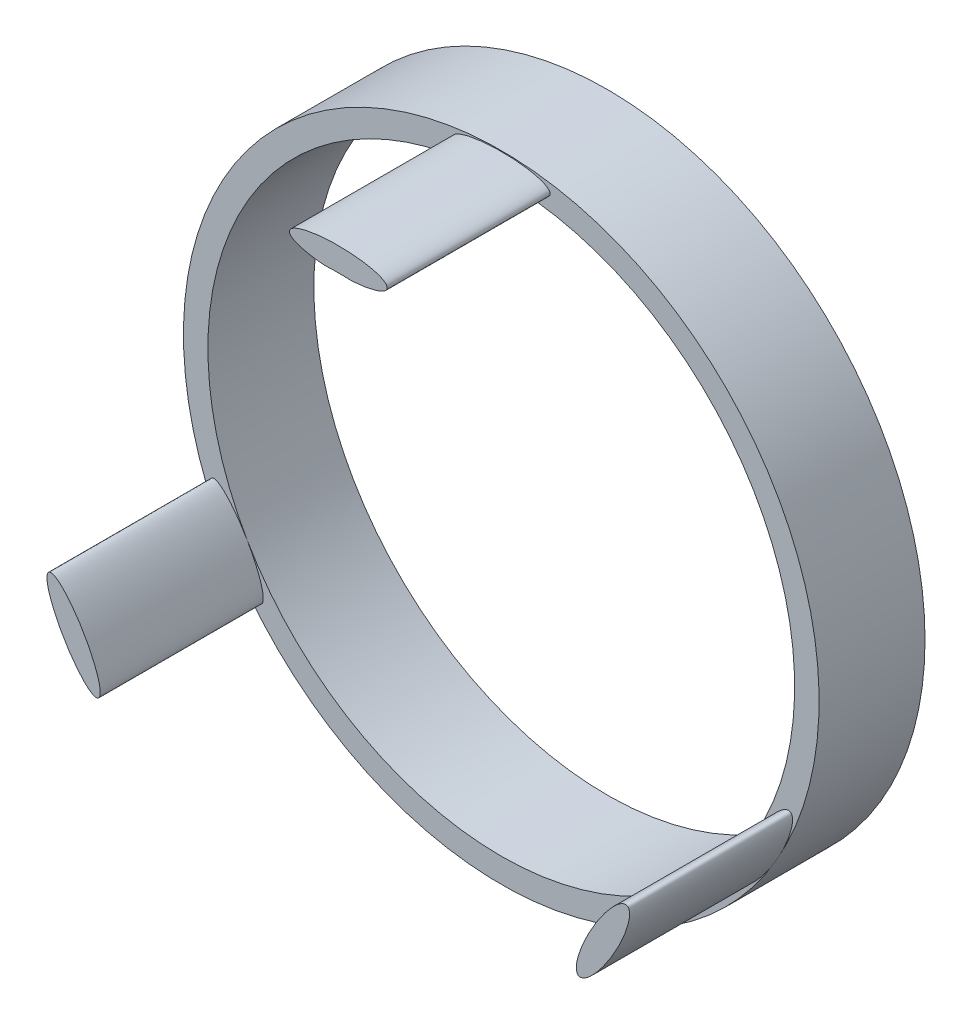
ISO-10303-21;
HEADER;
FILE_DESCRIPTION(('STEP AP214'),'2;1');
FILE_NAME('part.step','',(''),(''),'','','');
FILE_SCHEMA(('AUTOMOTIVE_DESIGN { 1 0 10303 214 1 1 1 1 }'));
ENDSEC;
DATA;
#1=APPLICATION_CONTEXT('core data for automotive mechanical design processes');
#2=APPLICATION_PROTOCOL_DEFINITION('international standard','automotive_design',2000,#1);
#3=PRODUCT_CONTEXT('',#1,'mechanical');
#4=PRODUCT('Part','Part','',(#3));
#5=PRODUCT_RELATED_PRODUCT_CATEGORY('part','',(#4));
#6=PRODUCT_DEFINITION_FORMATION('','',#4);
#7=PRODUCT_DEFINITION_CONTEXT('part definition',#1,'design');
#8=PRODUCT_DEFINITION('design','',#6,#7);
#9=PRODUCT_DEFINITION_SHAPE('','',#8);
#10=(LENGTH_UNIT() NAMED_UNIT(*) SI_UNIT(.MILLI.,.METRE.));
#11=(NAMED_UNIT(*) PLANE_ANGLE_UNIT() SI_UNIT($,.RADIAN.));
#12=(NAMED_UNIT(*) SI_UNIT($,.STERADIAN.) SOLID_ANGLE_UNIT());
#13=UNCERTAINTY_MEASURE_WITH_UNIT(LENGTH_MEASURE(1.E-05),#10,'distance_accuracy_value','');
#14=(GEOMETRIC_REPRESENTATION_CONTEXT(3) GLOBAL_UNCERTAINTY_ASSIGNED_CONTEXT((#13)) GLOBAL_UNIT_ASSIGNED_CONTEXT((#10,
#11,#12)) REPRESENTATION_CONTEXT('',''));
#15=CARTESIAN_POINT('',(0.,0.,0.));
#16=DIRECTION('',(0.,0.,1.));
#17=DIRECTION('',(1.,0.,0.));
#18=AXIS2_PLACEMENT_3D('',#15,#16,#17);
#19=CARTESIAN_POINT('',(0.,0.,6.5));
#20=DIRECTION('',(0.,0.,1.));
#21=DIRECTION('',(1.,0.,0.));
#22=AXIS2_PLACEMENT_3D('',#19,#20,#21);
#23=PLANE('',#22);
#24=CARTESIAN_POINT('',(0.,0.,6.5));
#25=DIRECTION('',(0.,0.,1.));
#26=DIRECTION('',(1.,0.,0.));
#27=AXIS2_PLACEMENT_3D('',#24,#25,#26);
#28=CIRCLE('',#27,18.);
#29=CARTESIAN_POINT('',(15.5884572681198,-9.00000000000011,6.5));
#30=VERTEX_POINT('',#29);
#31=CARTESIAN_POINT('',(0.852605665125994,17.9797959827078,6.5));
#32=VERTEX_POINT('',#31);
#33=EDGE_CURVE('E89',#30,#32,#28,.T.);
#34=ORIENTED_EDGE('',*,*,#33,.F.);
#35=CARTESIAN_POINT('',(16.2379763209581,-9.37500000000014,6.5));
#36=DIRECTION('',(0.,0.,1.));
#37=DIRECTION('',(-0.500000000000008,-0.866025403784434,0.));
#38=AXIS2_PLACEMENT_3D('',#35,#36,#37);
#39=ELLIPSE('',#38,3.,0.750000000000003);
#40=CARTESIAN_POINT('',(16.8874953737942,-9.75000000000397,6.5));
#41=VERTEX_POINT('',#40);
#42=EDGE_CURVE('E55',#41,#30,#39,.T.);
#43=ORIENTED_EDGE('',*,*,#42,.F.);
#44=CARTESIAN_POINT('',(0.,0.,6.5));
#45=DIRECTION('',(0.,0.,1.));
#46=DIRECTION('',(1.,0.,0.));
#47=AXIS2_PLACEMENT_3D('',#44,#45,#46);
#48=CIRCLE('',#47,19.5);
#49=CARTESIAN_POINT('',(-16.8936536457525,-9.73932727123875,6.5));
#50=VERTEX_POINT('',#49);
#51=EDGE_CURVE('E49',#41,#50,#48,.T.);
#52=ORIENTED_EDGE('',*,*,#51,.T.);
#53=CARTESIAN_POINT('',(-16.2403459612265,-9.37089566265974,6.5));
#54=DIRECTION('',(0.,0.,1.));
#55=DIRECTION('',(-0.50000000000001,0.866025403784433,0.));
#56=AXIS2_PLACEMENT_3D('',#53,#54,#55);
#57=ELLIPSE('',#56,3.,0.75);
#58=CARTESIAN_POINT('',(-15.5898788578268,-8.99753728518448,6.5));
#59=VERTEX_POINT('',#58);
#60=EDGE_CURVE('E99',#59,#50,#57,.T.);
#61=ORIENTED_EDGE('',*,*,#60,.F.);
#62=CARTESIAN_POINT('',(-0.852605665125994,17.9797959827078,6.5));
#63=VERTEX_POINT('',#62);
#64=EDGE_CURVE('E237',#63,#59,#28,.T.);
#65=ORIENTED_EDGE('',*,*,#64,.F.);
#66=CARTESIAN_POINT('',(0.,18.6988693264893,6.5));
#67=DIRECTION('',(0.,0.,1.));
#68=DIRECTION('',(1.,0.,0.));
#69=AXIS2_PLACEMENT_3D('',#66,#67,#68);
#70=ELLIPSE('',#69,3.,0.750000000000001);
#71=EDGE_CURVE('E102',#32,#63,#70,.T.);
#72=ORIENTED_EDGE('',*,*,#71,.F.);
#73=EDGE_LOOP('',(#34,#43,#52,#61,#65,#72));
#74=FACE_BOUND('',#73,.T.);
#75=ADVANCED_FACE('F40',(#74),#23,.T.);
#76=EDGE_CURVE('E11',#50,#41,#48,.T.);
#77=ORIENTED_EDGE('',*,*,#76,.T.);
#78=EDGE_CURVE('E80',#30,#41,#39,.T.);
#79=ORIENTED_EDGE('',*,*,#78,.F.);
#80=EDGE_CURVE('E96',#59,#30,#28,.T.);
#81=ORIENTED_EDGE('',*,*,#80,.F.);
#82=EDGE_CURVE('E62',#50,#59,#57,.T.);
#83=ORIENTED_EDGE('',*,*,#82,.F.);
#84=EDGE_LOOP('',(#77,#79,#81,#83));
#85=FACE_BOUND('',#84,.T.);
#86=ADVANCED_FACE('F95',(#85),#23,.T.);
#87=CARTESIAN_POINT('',(0.,0.,0.));
#88=DIRECTION('',(0.,0.,1.));
#89=DIRECTION('',(1.,0.,0.));
#90=AXIS2_PLACEMENT_3D('',#87,#88,#89);
#91=PLANE('',#90);
#92=CARTESIAN_POINT('',(0.,0.,0.));
#93=DIRECTION('',(0.,0.,1.));
#94=DIRECTION('',(1.,0.,0.));
#95=AXIS2_PLACEMENT_3D('',#92,#93,#94);
#96=CIRCLE('',#95,19.5);
#97=CARTESIAN_POINT('',(19.5,0.,0.));
#98=VERTEX_POINT('',#97);
#99=EDGE_CURVE('E44',#98,#98,#96,.T.);
#100=ORIENTED_EDGE('',*,*,#99,.F.);
#101=EDGE_LOOP('',(#100));
#102=FACE_BOUND('',#101,.T.);
#103=CARTESIAN_POINT('',(0.,0.,0.));
#104=DIRECTION('',(0.,0.,1.));
#105=DIRECTION('',(1.,0.,0.));
#106=AXIS2_PLACEMENT_3D('',#103,#104,#105);
#107=CIRCLE('',#106,18.);
#108=CARTESIAN_POINT('',(18.,0.,0.));
#109=VERTEX_POINT('',#108);
#110=EDGE_CURVE('E232',#109,#109,#107,.T.);
#111=ORIENTED_EDGE('',*,*,#110,.T.);
#112=EDGE_LOOP('',(#111));
#113=FACE_BOUND('',#112,.T.);
#114=ADVANCED_FACE('F127',(#102,#113),#91,.F.);
#115=CARTESIAN_POINT('',(0.,0.,6.5));
#116=DIRECTION('',(0.,0.,-1.));
#117=DIRECTION('',(-1.,0.,0.));
#118=AXIS2_PLACEMENT_3D('',#115,#116,#117);
#119=CYLINDRICAL_SURFACE('',#118,19.5);
#120=ORIENTED_EDGE('',*,*,#76,.F.);
#121=ORIENTED_EDGE('',*,*,#51,.F.);
#122=EDGE_LOOP('',(#120,#121));
#123=FACE_BOUND('',#122,.T.);
#124=ORIENTED_EDGE('',*,*,#99,.T.);
#125=EDGE_LOOP('',(#124));
#126=FACE_BOUND('',#125,.T.);
#127=ADVANCED_FACE('F42',(#123,#126),#119,.T.);
#128=CARTESIAN_POINT('',(0.,0.,6.5));
#129=DIRECTION('',(0.,0.,-1.));
#130=DIRECTION('',(-1.,0.,0.));
#131=AXIS2_PLACEMENT_3D('',#128,#129,#130);
#132=CYLINDRICAL_SURFACE('',#131,18.);
#133=ORIENTED_EDGE('',*,*,#64,.T.);
#134=ORIENTED_EDGE('',*,*,#80,.T.);
#135=ORIENTED_EDGE('',*,*,#33,.T.);
#136=DIRECTION('',(0.,0.,-1.));
#137=VECTOR('',#136,1.);
#138=CARTESIAN_POINT('',(0.852605665125994,17.9797959827078,16.5));
#139=LINE('',#138,#137);
#140=CARTESIAN_POINT('',(0.852605665125994,17.9797959827078,16.5));
#141=VERTEX_POINT('',#140);
#142=EDGE_CURVE('E229',#141,#32,#139,.T.);
#143=ORIENTED_EDGE('',*,*,#142,.F.);
#144=CARTESIAN_POINT('',(0.,0.,16.5));
#145=DIRECTION('',(0.,0.,1.));
#146=DIRECTION('',(1.,0.,0.));
#147=AXIS2_PLACEMENT_3D('',#144,#145,#146);
#148=CIRCLE('',#147,18.);
#149=CARTESIAN_POINT('',(-0.852605665125994,17.9797959827078,16.5));
#150=VERTEX_POINT('',#149);
#151=EDGE_CURVE('E106',#150,#141,#148,.F.);
#152=ORIENTED_EDGE('',*,*,#151,.F.);
#153=DIRECTION('',(0.,0.,-1.));
#154=VECTOR('',#153,1.);
#155=CARTESIAN_POINT('',(-0.852605665125994,17.9797959827078,16.5));
#156=LINE('',#155,#154);
#157=EDGE_CURVE('E112',#150,#63,#156,.T.);
#158=ORIENTED_EDGE('',*,*,#157,.T.);
#159=EDGE_LOOP('',(#133,#134,#135,#143,#152,#158));
#160=FACE_BOUND('',#159,.T.);
#161=ORIENTED_EDGE('',*,*,#110,.F.);
#162=EDGE_LOOP('',(#161));
#163=FACE_BOUND('',#162,.T.);
#164=ADVANCED_FACE('F120',(#160,#163),#132,.F.);
#165=CARTESIAN_POINT('',(0.,18.6988693264893,16.5));
#166=DIRECTION('',(0.,0.,1.));
#167=DIRECTION('',(1.,0.,0.));
#168=AXIS2_PLACEMENT_3D('',#165,#166,#167);
#169=ELLIPSE('',#168,3.,0.750000000000001);
#170=DIRECTION('',(0.,0.,-1.));
#171=VECTOR('',#170,1.);
#172=SURFACE_OF_LINEAR_EXTRUSION('',#169,#171);
#173=ORIENTED_EDGE('',*,*,#71,.T.);
#174=ORIENTED_EDGE('',*,*,#157,.F.);
#175=EDGE_CURVE('E109',#141,#150,#169,.T.);
#176=ORIENTED_EDGE('',*,*,#175,.F.);
#177=ORIENTED_EDGE('',*,*,#142,.T.);
#178=EDGE_LOOP('',(#173,#174,#176,#177));
#179=FACE_BOUND('',#178,.T.);
#180=ADVANCED_FACE('F115',(#179),#172,.F.);
#181=CARTESIAN_POINT('',(0.,0.,16.5));
#182=DIRECTION('',(0.,0.,1.));
#183=DIRECTION('',(1.,0.,0.));
#184=AXIS2_PLACEMENT_3D('',#181,#182,#183);
#185=PLANE('',#184);
#186=ORIENTED_EDGE('',*,*,#151,.T.);
#187=ORIENTED_EDGE('',*,*,#175,.T.);
#188=EDGE_LOOP('',(#186,#187));
#189=FACE_BOUND('',#188,.T.);
#190=ADVANCED_FACE('F119',(#189),#185,.T.);
#191=CARTESIAN_POINT('',(-16.2403459612265,-9.37089566265974,16.5));
#192=DIRECTION('',(0.,0.,1.));
#193=DIRECTION('',(-0.50000000000001,0.866025403784433,0.));
#194=AXIS2_PLACEMENT_3D('',#191,#192,#193);
#195=ELLIPSE('',#194,3.,0.75);
#196=DIRECTION('',(0.,0.,-1.));
#197=VECTOR('',#196,1.);
#198=SURFACE_OF_LINEAR_EXTRUSION('',#195,#197);
#199=CARTESIAN_POINT('',(-17.7403459612265,-6.77281945130644,16.5));
#200=VERTEX_POINT('',#199);
#201=EDGE_CURVE('E98',#200,#200,#195,.T.);
#202=ORIENTED_EDGE('',*,*,#201,.F.);
#203=EDGE_LOOP('',(#202));
#204=FACE_BOUND('',#203,.T.);
#205=ORIENTED_EDGE('',*,*,#82,.T.);
#206=ORIENTED_EDGE('',*,*,#60,.T.);
#207=EDGE_LOOP('',(#205,#206));
#208=FACE_BOUND('',#207,.T.);
#209=ADVANCED_FACE('F170',(#204,#208),#198,.F.);
#210=CARTESIAN_POINT('',(0.,0.,16.5));
#211=DIRECTION('',(0.,0.,1.));
#212=DIRECTION('',(1.,0.,0.));
#213=AXIS2_PLACEMENT_3D('',#210,#211,#212);
#214=PLANE('',#213);
#215=ORIENTED_EDGE('',*,*,#201,.T.);
#216=EDGE_LOOP('',(#215));
#217=FACE_BOUND('',#216,.T.);
#218=ADVANCED_FACE('F179',(#217),#214,.T.);
#219=CARTESIAN_POINT('',(16.2379763209581,-9.37500000000014,16.5));
#220=DIRECTION('',(0.,0.,1.));
#221=DIRECTION('',(-0.500000000000008,-0.866025403784434,0.));
#222=AXIS2_PLACEMENT_3D('',#219,#220,#221);
#223=ELLIPSE('',#222,3.,0.750000000000003);
#224=DIRECTION('',(0.,0.,-1.));
#225=VECTOR('',#224,1.);
#226=SURFACE_OF_LINEAR_EXTRUSION('',#223,#225);
#227=CARTESIAN_POINT('',(14.7379763209581,-11.9730762113534,16.5));
#228=VERTEX_POINT('',#227);
#229=EDGE_CURVE('E91',#228,#228,#223,.T.);
#230=ORIENTED_EDGE('',*,*,#229,.F.);
#231=EDGE_LOOP('',(#230));
#232=FACE_BOUND('',#231,.T.);
#233=ORIENTED_EDGE('',*,*,#42,.T.);
#234=ORIENTED_EDGE('',*,*,#78,.T.);
#235=EDGE_LOOP('',(#233,#234));
#236=FACE_BOUND('',#235,.T.);
#237=ADVANCED_FACE('F81',(#232,#236),#226,.F.);
#238=CARTESIAN_POINT('',(0.,0.,16.5));
#239=DIRECTION('',(0.,0.,1.));
#240=DIRECTION('',(1.,0.,0.));
#241=AXIS2_PLACEMENT_3D('',#238,#239,#240);
#242=PLANE('',#241);
#243=ORIENTED_EDGE('',*,*,#229,.T.);
#244=EDGE_LOOP('',(#243));
#245=FACE_BOUND('',#244,.T.);
#246=ADVANCED_FACE('F198',(#245),#242,.T.);
#247=CLOSED_SHELL('',(#75,#86,#114,#127,#164,#180,#190,#209,#218,#237,#246));
#248=MANIFOLD_SOLID_BREP('B2',#247);
#249=ADVANCED_BREP_SHAPE_REPRESENTATION('',(#18,#248),#14);
#250=SHAPE_DEFINITION_REPRESENTATION(#9,#249);
ENDSEC;
END-ISO-10303-21;
